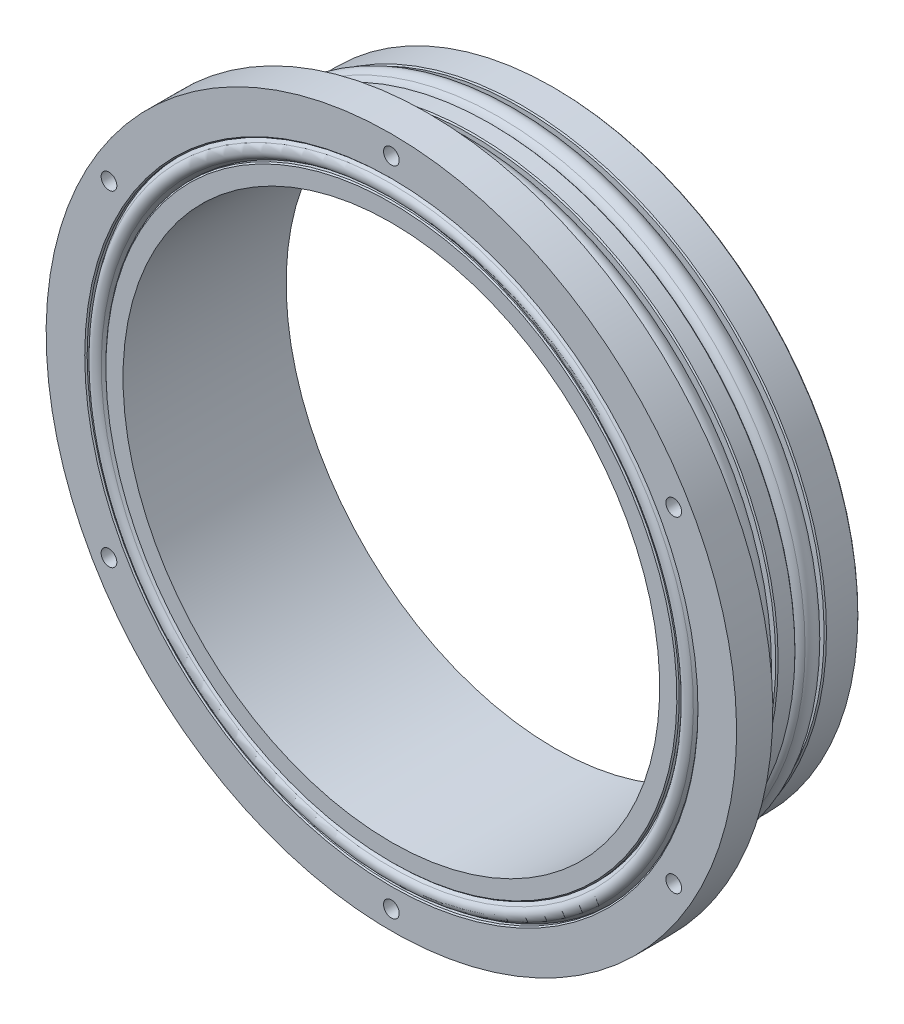
ISO-10303-21;
HEADER;
FILE_DESCRIPTION(('STEP AP214'),'2;1');
FILE_NAME('part.step','',(''),(''),'','','');
FILE_SCHEMA(('AUTOMOTIVE_DESIGN { 1 0 10303 214 1 1 1 1 }'));
ENDSEC;
DATA;
#1=APPLICATION_CONTEXT('core data for automotive mechanical design processes');
#2=APPLICATION_PROTOCOL_DEFINITION('international standard','automotive_design',2000,#1);
#3=PRODUCT_CONTEXT('',#1,'mechanical');
#4=PRODUCT('Part','Part','',(#3));
#5=PRODUCT_RELATED_PRODUCT_CATEGORY('part','',(#4));
#6=PRODUCT_DEFINITION_FORMATION('','',#4);
#7=PRODUCT_DEFINITION_CONTEXT('part definition',#1,'design');
#8=PRODUCT_DEFINITION('design','',#6,#7);
#9=PRODUCT_DEFINITION_SHAPE('','',#8);
#10=(LENGTH_UNIT() NAMED_UNIT(*) SI_UNIT(.MILLI.,.METRE.));
#11=(NAMED_UNIT(*) PLANE_ANGLE_UNIT() SI_UNIT($,.RADIAN.));
#12=(NAMED_UNIT(*) SI_UNIT($,.STERADIAN.) SOLID_ANGLE_UNIT());
#13=UNCERTAINTY_MEASURE_WITH_UNIT(LENGTH_MEASURE(1.E-05),#10,'distance_accuracy_value','');
#14=(GEOMETRIC_REPRESENTATION_CONTEXT(3) GLOBAL_UNCERTAINTY_ASSIGNED_CONTEXT((#13)) GLOBAL_UNIT_ASSIGNED_CONTEXT((#10,
#11,#12)) REPRESENTATION_CONTEXT('',''));
#15=CARTESIAN_POINT('',(0.,0.,0.));
#16=DIRECTION('',(0.,0.,1.));
#17=DIRECTION('',(1.,0.,0.));
#18=AXIS2_PLACEMENT_3D('',#15,#16,#17);
#19=CARTESIAN_POINT('',(0.,0.,136.547343325495));
#20=DIRECTION('',(0.,0.,-1.));
#21=DIRECTION('',(-1.,0.,0.));
#22=AXIS2_PLACEMENT_3D('',#19,#20,#21);
#23=TOROIDAL_SURFACE('',#22,49.1871,1.7653);
#24=CARTESIAN_POINT('',(-50.9524,0.,136.547343325495));
#25=VERTEX_POINT('',#24);
#26=VERTEX_LOOP('',#25);
#27=FACE_BOUND('',#26,.T.);
#28=ADVANCED_FACE('P0_F12',(#27),#23,.T.);
#29=CLOSED_SHELL('',(#28));
#30=MANIFOLD_SOLID_BREP('P0_B1',#29);
#31=CARTESIAN_POINT('',(0.,0.,144.618536633048));
#32=DIRECTION('',(0.,0.,-1.));
#33=DIRECTION('',(-1.,0.,0.));
#34=AXIS2_PLACEMENT_3D('',#31,#32,#33);
#35=TOROIDAL_SURFACE('',#34,49.1871,1.7653);
#36=CARTESIAN_POINT('',(-50.9524,0.,144.618536633048));
#37=VERTEX_POINT('',#36);
#38=VERTEX_LOOP('',#37);
#39=FACE_BOUND('',#38,.T.);
#40=ADVANCED_FACE('P1_F12',(#39),#35,.T.);
#41=CLOSED_SHELL('',(#40));
#42=MANIFOLD_SOLID_BREP('P1_B1',#41);
#43=CARTESIAN_POINT('',(0.,44.419,128.225));
#44=DIRECTION('',(0.,0.,-1.));
#45=DIRECTION('',(0.,1.,0.));
#46=AXIS2_PLACEMENT_3D('',#43,#44,#45);
#47=PLANE('',#46);
#48=CARTESIAN_POINT('',(0.,-46.99,128.225));
#49=DIRECTION('',(0.,0.,-1.));
#50=DIRECTION('',(0.,1.,0.));
#51=AXIS2_PLACEMENT_3D('',#48,#49,#50);
#52=CIRCLE('',#51,1.3);
#53=CARTESIAN_POINT('',(0.,-45.69,128.225));
#54=VERTEX_POINT('',#53);
#55=EDGE_CURVE('P2_E170',#54,#54,#52,.T.);
#56=ORIENTED_EDGE('',*,*,#55,.F.);
#57=EDGE_LOOP('',(#56));
#58=FACE_BOUND('',#57,.T.);
#59=CARTESIAN_POINT('',(-46.99,0.,128.225));
#60=DIRECTION('',(0.,0.,-1.));
#61=DIRECTION('',(0.,1.,0.));
#62=AXIS2_PLACEMENT_3D('',#59,#60,#61);
#63=CIRCLE('',#62,1.3);
#64=CARTESIAN_POINT('',(-46.99,1.3,128.225));
#65=VERTEX_POINT('',#64);
#66=EDGE_CURVE('P2_E164',#65,#65,#63,.T.);
#67=ORIENTED_EDGE('',*,*,#66,.F.);
#68=EDGE_LOOP('',(#67));
#69=FACE_BOUND('',#68,.T.);
#70=CARTESIAN_POINT('',(0.,46.99,128.225));
#71=DIRECTION('',(0.,0.,-1.));
#72=DIRECTION('',(0.,1.,0.));
#73=AXIS2_PLACEMENT_3D('',#70,#71,#72);
#74=CIRCLE('',#73,1.3);
#75=CARTESIAN_POINT('',(0.,48.29,128.225));
#76=VERTEX_POINT('',#75);
#77=EDGE_CURVE('P2_E158',#76,#76,#74,.T.);
#78=ORIENTED_EDGE('',*,*,#77,.F.);
#79=EDGE_LOOP('',(#78));
#80=FACE_BOUND('',#79,.T.);
#81=CARTESIAN_POINT('',(46.99,0.,128.225));
#82=DIRECTION('',(0.,0.,-1.));
#83=DIRECTION('',(0.,1.,0.));
#84=AXIS2_PLACEMENT_3D('',#81,#82,#83);
#85=CIRCLE('',#84,1.3);
#86=CARTESIAN_POINT('',(46.99,1.3,128.225));
#87=VERTEX_POINT('',#86);
#88=EDGE_CURVE('P2_E152',#87,#87,#85,.T.);
#89=ORIENTED_EDGE('',*,*,#88,.F.);
#90=EDGE_LOOP('',(#89));
#91=FACE_BOUND('',#90,.T.);
#92=CARTESIAN_POINT('',(0.,0.,128.225));
#93=DIRECTION('',(0.,0.,-1.));
#94=DIRECTION('',(0.,1.,0.));
#95=AXIS2_PLACEMENT_3D('',#92,#93,#94);
#96=CIRCLE('',#95,50.219);
#97=CARTESIAN_POINT('',(0.,50.219,128.225));
#98=VERTEX_POINT('',#97);
#99=EDGE_CURVE('P2_E49',#98,#98,#96,.T.);
#100=ORIENTED_EDGE('',*,*,#99,.T.);
#101=EDGE_LOOP('',(#100));
#102=FACE_BOUND('',#101,.T.);
#103=CARTESIAN_POINT('',(0.,0.,128.225));
#104=DIRECTION('',(0.,0.,-1.));
#105=DIRECTION('',(0.,1.,0.));
#106=AXIS2_PLACEMENT_3D('',#103,#104,#105);
#107=CIRCLE('',#106,44.419);
#108=CARTESIAN_POINT('',(0.,44.419,128.225));
#109=VERTEX_POINT('',#108);
#110=EDGE_CURVE('P2_E112',#109,#109,#107,.T.);
#111=ORIENTED_EDGE('',*,*,#110,.F.);
#112=EDGE_LOOP('',(#111));
#113=FACE_BOUND('',#112,.T.);
#114=ADVANCED_FACE('P2_F14',(#58,#69,#80,#91,#102,#113),#47,.T.);
#115=CARTESIAN_POINT('',(0.,0.,128.225));
#116=DIRECTION('',(0.,0.,-1.));
#117=DIRECTION('',(0.,1.,0.));
#118=AXIS2_PLACEMENT_3D('',#115,#116,#117);
#119=CYLINDRICAL_SURFACE('',#118,50.419);
#120=CARTESIAN_POINT('',(0.,0.,128.425));
#121=DIRECTION('',(0.,0.,-1.));
#122=DIRECTION('',(0.,1.,0.));
#123=AXIS2_PLACEMENT_3D('',#120,#121,#122);
#124=CIRCLE('',#123,50.419);
#125=CARTESIAN_POINT('',(0.,50.419,128.425));
#126=VERTEX_POINT('',#125);
#127=EDGE_CURVE('P2_E43',#126,#126,#124,.F.);
#128=ORIENTED_EDGE('',*,*,#127,.T.);
#129=EDGE_LOOP('',(#128));
#130=FACE_BOUND('',#129,.T.);
#131=CARTESIAN_POINT('',(0.,0.,133.612));
#132=DIRECTION('',(0.,0.,1.));
#133=DIRECTION('',(0.,-1.,0.));
#134=AXIS2_PLACEMENT_3D('',#131,#132,#133);
#135=CIRCLE('',#134,50.419);
#136=CARTESIAN_POINT('',(0.,-50.419,133.612));
#137=VERTEX_POINT('',#136);
#138=EDGE_CURVE('P2_E46',#137,#137,#135,.F.);
#139=ORIENTED_EDGE('',*,*,#138,.T.);
#140=EDGE_LOOP('',(#139));
#141=FACE_BOUND('',#140,.T.);
#142=ADVANCED_FACE('P2_F187',(#130,#141),#119,.T.);
#143=CARTESIAN_POINT('',(0.,49.04105,133.812));
#144=DIRECTION('',(0.,0.,1.));
#145=DIRECTION('',(0.,-1.,0.));
#146=AXIS2_PLACEMENT_3D('',#143,#144,#145);
#147=PLANE('',#146);
#148=CARTESIAN_POINT('',(0.,0.,133.812));
#149=DIRECTION('',(0.,0.,1.));
#150=DIRECTION('',(0.,-1.,0.));
#151=AXIS2_PLACEMENT_3D('',#148,#149,#150);
#152=CIRCLE('',#151,50.219);
#153=CARTESIAN_POINT('',(0.,-50.219,133.812));
#154=VERTEX_POINT('',#153);
#155=EDGE_CURVE('P2_E34',#154,#154,#152,.T.);
#156=ORIENTED_EDGE('',*,*,#155,.T.);
#157=EDGE_LOOP('',(#156));
#158=FACE_BOUND('',#157,.T.);
#159=CARTESIAN_POINT('',(0.,0.,133.812));
#160=DIRECTION('',(0.,0.,-1.));
#161=DIRECTION('',(0.,1.,0.));
#162=AXIS2_PLACEMENT_3D('',#159,#160,#161);
#163=CIRCLE('',#162,49.04105);
#164=CARTESIAN_POINT('',(0.,49.04105,133.812));
#165=VERTEX_POINT('',#164);
#166=EDGE_CURVE('P2_E64',#165,#165,#163,.T.);
#167=ORIENTED_EDGE('',*,*,#166,.T.);
#168=EDGE_LOOP('',(#167));
#169=FACE_BOUND('',#168,.T.);
#170=ADVANCED_FACE('P2_F288',(#158,#169),#147,.T.);
#171=CARTESIAN_POINT('',(0.,0.,133.812));
#172=DIRECTION('',(0.,0.,1.));
#173=DIRECTION('',(0.,-1.,0.));
#174=AXIS2_PLACEMENT_3D('',#171,#172,#173);
#175=CONICAL_SURFACE('',#174,49.04105,0.966336052037726);
#176=CARTESIAN_POINT('',(0.,0.,134.772495355148));
#177=DIRECTION('',(0.,0.,-1.));
#178=DIRECTION('',(0.,1.,0.));
#179=AXIS2_PLACEMENT_3D('',#176,#177,#178);
#180=CIRCLE('',#179,50.431651885961);
#181=CARTESIAN_POINT('',(0.,50.431651885961,134.772495355148));
#182=VERTEX_POINT('',#181);
#183=EDGE_CURVE('P2_E67',#182,#182,#180,.T.);
#184=ORIENTED_EDGE('',*,*,#183,.T.);
#185=EDGE_LOOP('',(#184));
#186=FACE_BOUND('',#185,.T.);
#187=ORIENTED_EDGE('',*,*,#166,.F.);
#188=EDGE_LOOP('',(#187));
#189=FACE_BOUND('',#188,.T.);
#190=ADVANCED_FACE('P2_F284',(#186,#189),#175,.T.);
#191=CARTESIAN_POINT('',(0.,0.,136.225));
#192=DIRECTION('',(0.,0.,-1.));
#193=DIRECTION('',(0.,1.,0.));
#194=AXIS2_PLACEMENT_3D('',#191,#192,#193);
#195=TOROIDAL_SURFACE('',#194,49.4284,1.7653);
#196=CARTESIAN_POINT('',(0.,0.,137.677504644852));
#197=DIRECTION('',(0.,0.,-1.));
#198=DIRECTION('',(0.,1.,0.));
#199=AXIS2_PLACEMENT_3D('',#196,#197,#198);
#200=CIRCLE('',#199,50.431651885961);
#201=CARTESIAN_POINT('',(0.,50.431651885961,137.677504644852));
#202=VERTEX_POINT('',#201);
#203=EDGE_CURVE('P2_E70',#202,#202,#200,.T.);
#204=ORIENTED_EDGE('',*,*,#203,.T.);
#205=EDGE_LOOP('',(#204));
#206=FACE_BOUND('',#205,.T.);
#207=ORIENTED_EDGE('',*,*,#183,.F.);
#208=EDGE_LOOP('',(#207));
#209=FACE_BOUND('',#208,.T.);
#210=ADVANCED_FACE('P2_F280',(#206,#209),#195,.T.);
#211=CARTESIAN_POINT('',(0.,0.,137.677504644852));
#212=DIRECTION('',(0.,0.,-1.));
#213=DIRECTION('',(0.,1.,0.));
#214=AXIS2_PLACEMENT_3D('',#211,#212,#213);
#215=CONICAL_SURFACE('',#214,50.431651885961,0.966336052037726);
#216=CARTESIAN_POINT('',(0.,0.,138.638));
#217=DIRECTION('',(0.,0.,-1.));
#218=DIRECTION('',(0.,1.,0.));
#219=AXIS2_PLACEMENT_3D('',#216,#217,#218);
#220=CIRCLE('',#219,49.04105);
#221=CARTESIAN_POINT('',(0.,49.04105,138.638));
#222=VERTEX_POINT('',#221);
#223=EDGE_CURVE('P2_E73',#222,#222,#220,.T.);
#224=ORIENTED_EDGE('',*,*,#223,.T.);
#225=EDGE_LOOP('',(#224));
#226=FACE_BOUND('',#225,.T.);
#227=ORIENTED_EDGE('',*,*,#203,.F.);
#228=EDGE_LOOP('',(#227));
#229=FACE_BOUND('',#228,.T.);
#230=ADVANCED_FACE('P2_F276',(#226,#229),#215,.T.);
#231=CARTESIAN_POINT('',(0.,50.419,138.638));
#232=DIRECTION('',(0.,0.,-1.));
#233=DIRECTION('',(0.,1.,0.));
#234=AXIS2_PLACEMENT_3D('',#231,#232,#233);
#235=PLANE('',#234);
#236=CARTESIAN_POINT('',(0.,0.,138.638));
#237=DIRECTION('',(0.,0.,-1.));
#238=DIRECTION('',(0.,1.,0.));
#239=AXIS2_PLACEMENT_3D('',#236,#237,#238);
#240=CIRCLE('',#239,50.219);
#241=CARTESIAN_POINT('',(0.,50.219,138.638));
#242=VERTEX_POINT('',#241);
#243=EDGE_CURVE('P2_E29',#242,#242,#240,.T.);
#244=ORIENTED_EDGE('',*,*,#243,.T.);
#245=EDGE_LOOP('',(#244));
#246=FACE_BOUND('',#245,.T.);
#247=ORIENTED_EDGE('',*,*,#223,.F.);
#248=EDGE_LOOP('',(#247));
#249=FACE_BOUND('',#248,.T.);
#250=ADVANCED_FACE('P2_F273',(#246,#249),#235,.T.);
#251=CARTESIAN_POINT('',(0.,0.,128.225));
#252=DIRECTION('',(0.,0.,-1.));
#253=DIRECTION('',(0.,1.,0.));
#254=AXIS2_PLACEMENT_3D('',#251,#252,#253);
#255=CYLINDRICAL_SURFACE('',#254,50.419);
#256=CARTESIAN_POINT('',(0.,0.,138.838));
#257=DIRECTION('',(0.,0.,-1.));
#258=DIRECTION('',(0.,1.,0.));
#259=AXIS2_PLACEMENT_3D('',#256,#257,#258);
#260=CIRCLE('',#259,50.419);
#261=CARTESIAN_POINT('',(0.,50.419,138.838));
#262=VERTEX_POINT('',#261);
#263=EDGE_CURVE('P2_E21',#262,#262,#260,.F.);
#264=ORIENTED_EDGE('',*,*,#263,.T.);
#265=EDGE_LOOP('',(#264));
#266=FACE_BOUND('',#265,.T.);
#267=CARTESIAN_POINT('',(0.,0.,141.612));
#268=DIRECTION('',(0.,0.,1.));
#269=DIRECTION('',(0.,-1.,0.));
#270=AXIS2_PLACEMENT_3D('',#267,#268,#269);
#271=CIRCLE('',#270,50.419);
#272=CARTESIAN_POINT('',(0.,-50.419,141.612));
#273=VERTEX_POINT('',#272);
#274=EDGE_CURVE('P2_E25',#273,#273,#271,.F.);
#275=ORIENTED_EDGE('',*,*,#274,.T.);
#276=EDGE_LOOP('',(#275));
#277=FACE_BOUND('',#276,.T.);
#278=ADVANCED_FACE('P2_F270',(#266,#277),#255,.T.);
#279=CARTESIAN_POINT('',(0.,49.04105,141.812));
#280=DIRECTION('',(0.,0.,1.));
#281=DIRECTION('',(0.,-1.,0.));
#282=AXIS2_PLACEMENT_3D('',#279,#280,#281);
#283=PLANE('',#282);
#284=CARTESIAN_POINT('',(0.,0.,141.812));
#285=DIRECTION('',(0.,0.,1.));
#286=DIRECTION('',(0.,-1.,0.));
#287=AXIS2_PLACEMENT_3D('',#284,#285,#286);
#288=CIRCLE('',#287,50.219);
#289=CARTESIAN_POINT('',(0.,-50.219,141.812));
#290=VERTEX_POINT('',#289);
#291=EDGE_CURVE('P2_E10',#290,#290,#288,.T.);
#292=ORIENTED_EDGE('',*,*,#291,.T.);
#293=EDGE_LOOP('',(#292));
#294=FACE_BOUND('',#293,.T.);
#295=CARTESIAN_POINT('',(0.,0.,141.812));
#296=DIRECTION('',(0.,0.,-1.));
#297=DIRECTION('',(0.,1.,0.));
#298=AXIS2_PLACEMENT_3D('',#295,#296,#297);
#299=CIRCLE('',#298,49.04105);
#300=CARTESIAN_POINT('',(0.,49.04105,141.812));
#301=VERTEX_POINT('',#300);
#302=EDGE_CURVE('P2_E76',#301,#301,#299,.T.);
#303=ORIENTED_EDGE('',*,*,#302,.T.);
#304=EDGE_LOOP('',(#303));
#305=FACE_BOUND('',#304,.T.);
#306=ADVANCED_FACE('P2_F266',(#294,#305),#283,.T.);
#307=CARTESIAN_POINT('',(0.,0.,141.812));
#308=DIRECTION('',(0.,0.,1.));
#309=DIRECTION('',(0.,-1.,0.));
#310=AXIS2_PLACEMENT_3D('',#307,#308,#309);
#311=CONICAL_SURFACE('',#310,49.04105,0.966336052037727);
#312=CARTESIAN_POINT('',(0.,0.,142.772495355148));
#313=DIRECTION('',(0.,0.,-1.));
#314=DIRECTION('',(0.,1.,0.));
#315=AXIS2_PLACEMENT_3D('',#312,#313,#314);
#316=CIRCLE('',#315,50.431651885961);
#317=CARTESIAN_POINT('',(0.,50.431651885961,142.772495355148));
#318=VERTEX_POINT('',#317);
#319=EDGE_CURVE('P2_E79',#318,#318,#316,.T.);
#320=ORIENTED_EDGE('',*,*,#319,.T.);
#321=EDGE_LOOP('',(#320));
#322=FACE_BOUND('',#321,.T.);
#323=ORIENTED_EDGE('',*,*,#302,.F.);
#324=EDGE_LOOP('',(#323));
#325=FACE_BOUND('',#324,.T.);
#326=ADVANCED_FACE('P2_F262',(#322,#325),#311,.T.);
#327=CARTESIAN_POINT('',(0.,0.,144.225));
#328=DIRECTION('',(0.,0.,-1.));
#329=DIRECTION('',(0.,1.,0.));
#330=AXIS2_PLACEMENT_3D('',#327,#328,#329);
#331=TOROIDAL_SURFACE('',#330,49.4284,1.7653);
#332=CARTESIAN_POINT('',(0.,0.,145.677504644852));
#333=DIRECTION('',(0.,0.,-1.));
#334=DIRECTION('',(0.,1.,0.));
#335=AXIS2_PLACEMENT_3D('',#332,#333,#334);
#336=CIRCLE('',#335,50.431651885961);
#337=CARTESIAN_POINT('',(0.,50.431651885961,145.677504644852));
#338=VERTEX_POINT('',#337);
#339=EDGE_CURVE('P2_E82',#338,#338,#336,.T.);
#340=ORIENTED_EDGE('',*,*,#339,.T.);
#341=EDGE_LOOP('',(#340));
#342=FACE_BOUND('',#341,.T.);
#343=ORIENTED_EDGE('',*,*,#319,.F.);
#344=EDGE_LOOP('',(#343));
#345=FACE_BOUND('',#344,.T.);
#346=ADVANCED_FACE('P2_F258',(#342,#345),#331,.T.);
#347=CARTESIAN_POINT('',(0.,0.,145.677504644852));
#348=DIRECTION('',(0.,0.,-1.));
#349=DIRECTION('',(0.,1.,0.));
#350=AXIS2_PLACEMENT_3D('',#347,#348,#349);
#351=CONICAL_SURFACE('',#350,50.431651885961,0.966336052037724);
#352=CARTESIAN_POINT('',(0.,0.,146.638));
#353=DIRECTION('',(0.,0.,-1.));
#354=DIRECTION('',(0.,1.,0.));
#355=AXIS2_PLACEMENT_3D('',#352,#353,#354);
#356=CIRCLE('',#355,49.04105);
#357=CARTESIAN_POINT('',(0.,49.04105,146.638));
#358=VERTEX_POINT('',#357);
#359=EDGE_CURVE('P2_E85',#358,#358,#356,.T.);
#360=ORIENTED_EDGE('',*,*,#359,.T.);
#361=EDGE_LOOP('',(#360));
#362=FACE_BOUND('',#361,.T.);
#363=ORIENTED_EDGE('',*,*,#339,.F.);
#364=EDGE_LOOP('',(#363));
#365=FACE_BOUND('',#364,.T.);
#366=ADVANCED_FACE('P2_F254',(#362,#365),#351,.T.);
#367=CARTESIAN_POINT('',(0.,50.419,146.638));
#368=DIRECTION('',(0.,0.,-1.));
#369=DIRECTION('',(0.,1.,0.));
#370=AXIS2_PLACEMENT_3D('',#367,#368,#369);
#371=PLANE('',#370);
#372=CARTESIAN_POINT('',(0.,0.,146.638));
#373=DIRECTION('',(0.,0.,-1.));
#374=DIRECTION('',(0.,1.,0.));
#375=AXIS2_PLACEMENT_3D('',#372,#373,#374);
#376=CIRCLE('',#375,50.219);
#377=CARTESIAN_POINT('',(0.,50.219,146.638));
#378=VERTEX_POINT('',#377);
#379=EDGE_CURVE('P2_E40',#378,#378,#376,.T.);
#380=ORIENTED_EDGE('',*,*,#379,.T.);
#381=EDGE_LOOP('',(#380));
#382=FACE_BOUND('',#381,.T.);
#383=ORIENTED_EDGE('',*,*,#359,.F.);
#384=EDGE_LOOP('',(#383));
#385=FACE_BOUND('',#384,.T.);
#386=ADVANCED_FACE('P2_F250',(#382,#385),#371,.T.);
#387=CARTESIAN_POINT('',(0.,0.,128.225));
#388=DIRECTION('',(0.,0.,-1.));
#389=DIRECTION('',(0.,1.,0.));
#390=AXIS2_PLACEMENT_3D('',#387,#388,#389);
#391=CYLINDRICAL_SURFACE('',#390,50.419);
#392=CARTESIAN_POINT('',(0.,0.,146.838));
#393=DIRECTION('',(0.,0.,-1.));
#394=DIRECTION('',(0.,1.,0.));
#395=AXIS2_PLACEMENT_3D('',#392,#393,#394);
#396=CIRCLE('',#395,50.419);
#397=CARTESIAN_POINT('',(0.,50.419,146.838));
#398=VERTEX_POINT('',#397);
#399=EDGE_CURVE('P2_E37',#398,#398,#396,.F.);
#400=ORIENTED_EDGE('',*,*,#399,.T.);
#401=EDGE_LOOP('',(#400));
#402=FACE_BOUND('',#401,.T.);
#403=CARTESIAN_POINT('',(0.,0.,149.225));
#404=DIRECTION('',(0.,0.,-1.));
#405=DIRECTION('',(0.,1.,0.));
#406=AXIS2_PLACEMENT_3D('',#403,#404,#405);
#407=CIRCLE('',#406,50.419);
#408=CARTESIAN_POINT('',(0.,50.419,149.225));
#409=VERTEX_POINT('',#408);
#410=EDGE_CURVE('P2_E88',#409,#409,#407,.T.);
#411=ORIENTED_EDGE('',*,*,#410,.T.);
#412=EDGE_LOOP('',(#411));
#413=FACE_BOUND('',#412,.T.);
#414=ADVANCED_FACE('P2_F246',(#402,#413),#391,.T.);
#415=CARTESIAN_POINT('',(0.,50.419,149.225));
#416=DIRECTION('',(0.,0.,-1.));
#417=DIRECTION('',(0.,1.,0.));
#418=AXIS2_PLACEMENT_3D('',#415,#416,#417);
#419=PLANE('',#418);
#420=CARTESIAN_POINT('',(-46.7437211692651,26.9875,149.225));
#421=DIRECTION('',(0.,0.,-1.));
#422=DIRECTION('',(0.,1.,0.));
#423=AXIS2_PLACEMENT_3D('',#420,#421,#422);
#424=CIRCLE('',#423,1.3);
#425=CARTESIAN_POINT('',(-46.7437211692651,28.2875,149.225));
#426=VERTEX_POINT('',#425);
#427=EDGE_CURVE('P2_E145',#426,#426,#424,.F.);
#428=ORIENTED_EDGE('',*,*,#427,.T.);
#429=EDGE_LOOP('',(#428));
#430=FACE_BOUND('',#429,.T.);
#431=CARTESIAN_POINT('',(-46.7437211692651,-26.9875,149.225));
#432=DIRECTION('',(0.,0.,-1.));
#433=DIRECTION('',(0.,1.,0.));
#434=AXIS2_PLACEMENT_3D('',#431,#432,#433);
#435=CIRCLE('',#434,1.3);
#436=CARTESIAN_POINT('',(-46.7437211692651,-25.6875,149.225));
#437=VERTEX_POINT('',#436);
#438=EDGE_CURVE('P2_E139',#437,#437,#435,.F.);
#439=ORIENTED_EDGE('',*,*,#438,.T.);
#440=EDGE_LOOP('',(#439));
#441=FACE_BOUND('',#440,.T.);
#442=CARTESIAN_POINT('',(0.,-53.975,149.225));
#443=DIRECTION('',(0.,0.,-1.));
#444=DIRECTION('',(0.,1.,0.));
#445=AXIS2_PLACEMENT_3D('',#442,#443,#444);
#446=CIRCLE('',#445,1.3);
#447=CARTESIAN_POINT('',(0.,-52.675,149.225));
#448=VERTEX_POINT('',#447);
#449=EDGE_CURVE('P2_E133',#448,#448,#446,.F.);
#450=ORIENTED_EDGE('',*,*,#449,.T.);
#451=EDGE_LOOP('',(#450));
#452=FACE_BOUND('',#451,.T.);
#453=CARTESIAN_POINT('',(46.7437211692651,-26.9875,149.225));
#454=DIRECTION('',(0.,0.,-1.));
#455=DIRECTION('',(0.,1.,0.));
#456=AXIS2_PLACEMENT_3D('',#453,#454,#455);
#457=CIRCLE('',#456,1.3);
#458=CARTESIAN_POINT('',(46.7437211692651,-25.6875,149.225));
#459=VERTEX_POINT('',#458);
#460=EDGE_CURVE('P2_E127',#459,#459,#457,.F.);
#461=ORIENTED_EDGE('',*,*,#460,.T.);
#462=EDGE_LOOP('',(#461));
#463=FACE_BOUND('',#462,.T.);
#464=CARTESIAN_POINT('',(46.7437211692651,26.9875,149.225));
#465=DIRECTION('',(0.,0.,-1.));
#466=DIRECTION('',(0.,1.,0.));
#467=AXIS2_PLACEMENT_3D('',#464,#465,#466);
#468=CIRCLE('',#467,1.3);
#469=CARTESIAN_POINT('',(46.7437211692651,28.2875,149.225));
#470=VERTEX_POINT('',#469);
#471=EDGE_CURVE('P2_E121',#470,#470,#468,.F.);
#472=ORIENTED_EDGE('',*,*,#471,.T.);
#473=EDGE_LOOP('',(#472));
#474=FACE_BOUND('',#473,.T.);
#475=CARTESIAN_POINT('',(0.,53.975,149.225));
#476=DIRECTION('',(0.,0.,-1.));
#477=DIRECTION('',(0.,1.,0.));
#478=AXIS2_PLACEMENT_3D('',#475,#476,#477);
#479=CIRCLE('',#478,1.3);
#480=CARTESIAN_POINT('',(0.,55.275,149.225));
#481=VERTEX_POINT('',#480);
#482=EDGE_CURVE('P2_E115',#481,#481,#479,.F.);
#483=ORIENTED_EDGE('',*,*,#482,.T.);
#484=EDGE_LOOP('',(#483));
#485=FACE_BOUND('',#484,.T.);
#486=CARTESIAN_POINT('',(0.,0.,149.225));
#487=DIRECTION('',(0.,0.,-1.));
#488=DIRECTION('',(0.,1.,0.));
#489=AXIS2_PLACEMENT_3D('',#486,#487,#488);
#490=CIRCLE('',#489,57.15);
#491=CARTESIAN_POINT('',(0.,57.15,149.225));
#492=VERTEX_POINT('',#491);
#493=EDGE_CURVE('P2_E91',#492,#492,#490,.T.);
#494=ORIENTED_EDGE('',*,*,#493,.T.);
#495=EDGE_LOOP('',(#494));
#496=FACE_BOUND('',#495,.T.);
#497=ORIENTED_EDGE('',*,*,#410,.F.);
#498=EDGE_LOOP('',(#497));
#499=FACE_BOUND('',#498,.T.);
#500=ADVANCED_FACE('P2_F242',(#430,#441,#452,#463,#474,#485,#496,#499),#419,.T.);
#501=CARTESIAN_POINT('',(0.,0.,128.225));
#502=DIRECTION('',(0.,0.,-1.));
#503=DIRECTION('',(0.,1.,0.));
#504=AXIS2_PLACEMENT_3D('',#501,#502,#503);
#505=CYLINDRICAL_SURFACE('',#504,57.15);
#506=CARTESIAN_POINT('',(0.,0.,155.225));
#507=DIRECTION('',(0.,0.,-1.));
#508=DIRECTION('',(0.,1.,0.));
#509=AXIS2_PLACEMENT_3D('',#506,#507,#508);
#510=CIRCLE('',#509,57.15);
#511=CARTESIAN_POINT('',(0.,57.15,155.225));
#512=VERTEX_POINT('',#511);
#513=EDGE_CURVE('P2_E94',#512,#512,#510,.T.);
#514=ORIENTED_EDGE('',*,*,#513,.T.);
#515=EDGE_LOOP('',(#514));
#516=FACE_BOUND('',#515,.T.);
#517=ORIENTED_EDGE('',*,*,#493,.F.);
#518=EDGE_LOOP('',(#517));
#519=FACE_BOUND('',#518,.T.);
#520=ADVANCED_FACE('P2_F238',(#516,#519),#505,.T.);
#521=CARTESIAN_POINT('',(0.,57.15,155.225));
#522=DIRECTION('',(0.,0.,1.));
#523=DIRECTION('',(0.,-1.,0.));
#524=AXIS2_PLACEMENT_3D('',#521,#522,#523);
#525=PLANE('',#524);
#526=CARTESIAN_POINT('',(0.,0.,155.225));
#527=DIRECTION('',(0.,0.,1.));
#528=DIRECTION('',(0.,-1.,0.));
#529=AXIS2_PLACEMENT_3D('',#526,#527,#528);
#530=CIRCLE('',#529,50.7587);
#531=CARTESIAN_POINT('',(0.,-50.7587,155.225));
#532=VERTEX_POINT('',#531);
#533=EDGE_CURVE('P2_E61',#532,#532,#530,.F.);
#534=ORIENTED_EDGE('',*,*,#533,.T.);
#535=EDGE_LOOP('',(#534));
#536=FACE_BOUND('',#535,.T.);
#537=CARTESIAN_POINT('',(-46.7437211692651,26.9875,155.225));
#538=DIRECTION('',(0.,0.,1.));
#539=DIRECTION('',(1.,0.,0.));
#540=AXIS2_PLACEMENT_3D('',#537,#538,#539);
#541=CIRCLE('',#540,1.3);
#542=CARTESIAN_POINT('',(-45.4437211692651,26.9875,155.225));
#543=VERTEX_POINT('',#542);
#544=EDGE_CURVE('P2_E148',#543,#543,#541,.T.);
#545=ORIENTED_EDGE('',*,*,#544,.F.);
#546=EDGE_LOOP('',(#545));
#547=FACE_BOUND('',#546,.T.);
#548=CARTESIAN_POINT('',(-46.7437211692651,-26.9875,155.225));
#549=DIRECTION('',(0.,0.,1.));
#550=DIRECTION('',(1.,0.,0.));
#551=AXIS2_PLACEMENT_3D('',#548,#549,#550);
#552=CIRCLE('',#551,1.3);
#553=CARTESIAN_POINT('',(-45.4437211692651,-26.9875,155.225));
#554=VERTEX_POINT('',#553);
#555=EDGE_CURVE('P2_E142',#554,#554,#552,.T.);
#556=ORIENTED_EDGE('',*,*,#555,.F.);
#557=EDGE_LOOP('',(#556));
#558=FACE_BOUND('',#557,.T.);
#559=CARTESIAN_POINT('',(0.,-53.975,155.225));
#560=DIRECTION('',(0.,0.,1.));
#561=DIRECTION('',(1.,0.,0.));
#562=AXIS2_PLACEMENT_3D('',#559,#560,#561);
#563=CIRCLE('',#562,1.3);
#564=CARTESIAN_POINT('',(1.30000000000001,-53.975,155.225));
#565=VERTEX_POINT('',#564);
#566=EDGE_CURVE('P2_E136',#565,#565,#563,.T.);
#567=ORIENTED_EDGE('',*,*,#566,.F.);
#568=EDGE_LOOP('',(#567));
#569=FACE_BOUND('',#568,.T.);
#570=CARTESIAN_POINT('',(46.7437211692651,-26.9875,155.225));
#571=DIRECTION('',(0.,0.,1.));
#572=DIRECTION('',(1.,0.,0.));
#573=AXIS2_PLACEMENT_3D('',#570,#571,#572);
#574=CIRCLE('',#573,1.3);
#575=CARTESIAN_POINT('',(48.0437211692651,-26.9875,155.225));
#576=VERTEX_POINT('',#575);
#577=EDGE_CURVE('P2_E130',#576,#576,#574,.T.);
#578=ORIENTED_EDGE('',*,*,#577,.F.);
#579=EDGE_LOOP('',(#578));
#580=FACE_BOUND('',#579,.T.);
#581=CARTESIAN_POINT('',(46.7437211692651,26.9875,155.225));
#582=DIRECTION('',(0.,0.,1.));
#583=DIRECTION('',(1.,0.,0.));
#584=AXIS2_PLACEMENT_3D('',#581,#582,#583);
#585=CIRCLE('',#584,1.3);
#586=CARTESIAN_POINT('',(48.0437211692651,26.9875,155.225));
#587=VERTEX_POINT('',#586);
#588=EDGE_CURVE('P2_E124',#587,#587,#585,.T.);
#589=ORIENTED_EDGE('',*,*,#588,.F.);
#590=EDGE_LOOP('',(#589));
#591=FACE_BOUND('',#590,.T.);
#592=CARTESIAN_POINT('',(0.,53.975,155.225));
#593=DIRECTION('',(0.,0.,1.));
#594=DIRECTION('',(1.,0.,0.));
#595=AXIS2_PLACEMENT_3D('',#592,#593,#594);
#596=CIRCLE('',#595,1.3);
#597=CARTESIAN_POINT('',(1.3,53.975,155.225));
#598=VERTEX_POINT('',#597);
#599=EDGE_CURVE('P2_E118',#598,#598,#596,.T.);
#600=ORIENTED_EDGE('',*,*,#599,.F.);
#601=EDGE_LOOP('',(#600));
#602=FACE_BOUND('',#601,.T.);
#603=ORIENTED_EDGE('',*,*,#513,.F.);
#604=EDGE_LOOP('',(#603));
#605=FACE_BOUND('',#604,.T.);
#606=ADVANCED_FACE('P2_F234',(#536,#547,#558,#569,#580,#591,#602,#605),#525,.T.);
#607=CARTESIAN_POINT('',(0.,0.,128.225));
#608=DIRECTION('',(0.,0.,-1.));
#609=DIRECTION('',(0.,1.,0.));
#610=AXIS2_PLACEMENT_3D('',#607,#608,#609);
#611=CYLINDRICAL_SURFACE('',#610,50.5587);
#612=CARTESIAN_POINT('',(0.,0.,155.025));
#613=DIRECTION('',(0.,0.,1.));
#614=DIRECTION('',(0.,-1.,0.));
#615=AXIS2_PLACEMENT_3D('',#612,#613,#614);
#616=CIRCLE('',#615,50.5587);
#617=CARTESIAN_POINT('',(0.,-50.5587,155.025));
#618=VERTEX_POINT('',#617);
#619=EDGE_CURVE('P2_E58',#618,#618,#616,.T.);
#620=ORIENTED_EDGE('',*,*,#619,.T.);
#621=EDGE_LOOP('',(#620));
#622=FACE_BOUND('',#621,.T.);
#623=CARTESIAN_POINT('',(0.,0.,154.504170235136));
#624=DIRECTION('',(0.,0.,-1.));
#625=DIRECTION('',(0.,1.,0.));
#626=AXIS2_PLACEMENT_3D('',#623,#624,#625);
#627=CIRCLE('',#626,50.5587);
#628=CARTESIAN_POINT('',(0.,50.5587,154.504170235136));
#629=VERTEX_POINT('',#628);
#630=EDGE_CURVE('P2_E97',#629,#629,#627,.T.);
#631=ORIENTED_EDGE('',*,*,#630,.T.);
#632=EDGE_LOOP('',(#631));
#633=FACE_BOUND('',#632,.T.);
#634=ADVANCED_FACE('P2_F230',(#622,#633),#611,.F.);
#635=CARTESIAN_POINT('',(0.,0.,154.504170235136));
#636=DIRECTION('',(0.,0.,-1.));
#637=DIRECTION('',(0.,1.,0.));
#638=AXIS2_PLACEMENT_3D('',#635,#636,#637);
#639=CONICAL_SURFACE('',#638,50.5587,0.634842696572141);
#640=CARTESIAN_POINT('',(0.,0.,155.244014620009));
#641=DIRECTION('',(0.,0.,-1.));
#642=DIRECTION('',(0.,1.,0.));
#643=AXIS2_PLACEMENT_3D('',#640,#641,#642);
#644=CIRCLE('',#643,50.0137615637377);
#645=CARTESIAN_POINT('',(0.,50.0137615637377,155.244014620009));
#646=VERTEX_POINT('',#645);
#647=EDGE_CURVE('P2_E100',#646,#646,#644,.T.);
#648=ORIENTED_EDGE('',*,*,#647,.T.);
#649=EDGE_LOOP('',(#648));
#650=FACE_BOUND('',#649,.T.);
#651=ORIENTED_EDGE('',*,*,#630,.F.);
#652=EDGE_LOOP('',(#651));
#653=FACE_BOUND('',#652,.T.);
#654=ADVANCED_FACE('P2_F226',(#650,#653),#639,.T.);
#655=CARTESIAN_POINT('',(0.,0.,154.504170235136));
#656=DIRECTION('',(0.,0.,-1.));
#657=DIRECTION('',(0.,1.,0.));
#658=AXIS2_PLACEMENT_3D('',#655,#656,#657);
#659=TOROIDAL_SURFACE('',#658,49.0093,1.24752264382461);
#660=CARTESIAN_POINT('',(0.,0.,155.244014620009));
#661=DIRECTION('',(0.,0.,-1.));
#662=DIRECTION('',(0.,1.,0.));
#663=AXIS2_PLACEMENT_3D('',#660,#661,#662);
#664=CIRCLE('',#663,48.0048384362623);
#665=CARTESIAN_POINT('',(0.,48.0048384362623,155.244014620009));
#666=VERTEX_POINT('',#665);
#667=EDGE_CURVE('P2_E103',#666,#666,#664,.T.);
#668=ORIENTED_EDGE('',*,*,#667,.T.);
#669=EDGE_LOOP('',(#668));
#670=FACE_BOUND('',#669,.T.);
#671=ORIENTED_EDGE('',*,*,#647,.F.);
#672=EDGE_LOOP('',(#671));
#673=FACE_BOUND('',#672,.T.);
#674=ADVANCED_FACE('P2_F222',(#670,#673),#659,.T.);
#675=CARTESIAN_POINT('',(0.,0.,155.244014620009));
#676=DIRECTION('',(0.,0.,1.));
#677=DIRECTION('',(0.,-1.,0.));
#678=AXIS2_PLACEMENT_3D('',#675,#676,#677);
#679=CONICAL_SURFACE('',#678,48.0048384362623,0.634842696572118);
#680=CARTESIAN_POINT('',(0.,0.,154.504170235136));
#681=DIRECTION('',(0.,0.,-1.));
#682=DIRECTION('',(0.,1.,0.));
#683=AXIS2_PLACEMENT_3D('',#680,#681,#682);
#684=CIRCLE('',#683,47.4599);
#685=CARTESIAN_POINT('',(0.,47.4599,154.504170235136));
#686=VERTEX_POINT('',#685);
#687=EDGE_CURVE('P2_E106',#686,#686,#684,.T.);
#688=ORIENTED_EDGE('',*,*,#687,.T.);
#689=EDGE_LOOP('',(#688));
#690=FACE_BOUND('',#689,.T.);
#691=ORIENTED_EDGE('',*,*,#667,.F.);
#692=EDGE_LOOP('',(#691));
#693=FACE_BOUND('',#692,.T.);
#694=ADVANCED_FACE('P2_F215',(#690,#693),#679,.F.);
#695=CARTESIAN_POINT('',(0.,0.,128.225));
#696=DIRECTION('',(0.,0.,-1.));
#697=DIRECTION('',(0.,1.,0.));
#698=AXIS2_PLACEMENT_3D('',#695,#696,#697);
#699=CYLINDRICAL_SURFACE('',#698,47.4599);
#700=CARTESIAN_POINT('',(0.,0.,155.025));
#701=DIRECTION('',(0.,0.,1.));
#702=DIRECTION('',(0.,-1.,0.));
#703=AXIS2_PLACEMENT_3D('',#700,#701,#702);
#704=CIRCLE('',#703,47.4599);
#705=CARTESIAN_POINT('',(0.,-47.4599,155.025));
#706=VERTEX_POINT('',#705);
#707=EDGE_CURVE('P2_E55',#706,#706,#704,.F.);
#708=ORIENTED_EDGE('',*,*,#707,.T.);
#709=EDGE_LOOP('',(#708));
#710=FACE_BOUND('',#709,.T.);
#711=ORIENTED_EDGE('',*,*,#687,.F.);
#712=EDGE_LOOP('',(#711));
#713=FACE_BOUND('',#712,.T.);
#714=ADVANCED_FACE('P2_F208',(#710,#713),#699,.T.);
#715=CARTESIAN_POINT('',(0.,47.4599,155.225));
#716=DIRECTION('',(0.,0.,1.));
#717=DIRECTION('',(0.,-1.,0.));
#718=AXIS2_PLACEMENT_3D('',#715,#716,#717);
#719=PLANE('',#718);
#720=CARTESIAN_POINT('',(0.,0.,155.225));
#721=DIRECTION('',(0.,0.,1.));
#722=DIRECTION('',(0.,-1.,0.));
#723=AXIS2_PLACEMENT_3D('',#720,#721,#722);
#724=CIRCLE('',#723,47.2599);
#725=CARTESIAN_POINT('',(0.,-47.2599,155.225));
#726=VERTEX_POINT('',#725);
#727=EDGE_CURVE('P2_E52',#726,#726,#724,.T.);
#728=ORIENTED_EDGE('',*,*,#727,.T.);
#729=EDGE_LOOP('',(#728));
#730=FACE_BOUND('',#729,.T.);
#731=CARTESIAN_POINT('',(0.,0.,155.225));
#732=DIRECTION('',(0.,0.,-1.));
#733=DIRECTION('',(0.,1.,0.));
#734=AXIS2_PLACEMENT_3D('',#731,#732,#733);
#735=CIRCLE('',#734,44.419);
#736=CARTESIAN_POINT('',(0.,44.419,155.225));
#737=VERTEX_POINT('',#736);
#738=EDGE_CURVE('P2_E109',#737,#737,#735,.T.);
#739=ORIENTED_EDGE('',*,*,#738,.T.);
#740=EDGE_LOOP('',(#739));
#741=FACE_BOUND('',#740,.T.);
#742=ADVANCED_FACE('P2_F203',(#730,#741),#719,.T.);
#743=CARTESIAN_POINT('',(0.,0.,128.225));
#744=DIRECTION('',(0.,0.,-1.));
#745=DIRECTION('',(0.,1.,0.));
#746=AXIS2_PLACEMENT_3D('',#743,#744,#745);
#747=CYLINDRICAL_SURFACE('',#746,44.419);
#748=ORIENTED_EDGE('',*,*,#110,.T.);
#749=EDGE_LOOP('',(#748));
#750=FACE_BOUND('',#749,.T.);
#751=ORIENTED_EDGE('',*,*,#738,.F.);
#752=EDGE_LOOP('',(#751));
#753=FACE_BOUND('',#752,.T.);
#754=ADVANCED_FACE('P2_F199',(#750,#753),#747,.F.);
#755=CARTESIAN_POINT('',(0.,53.975,145.54804473783));
#756=DIRECTION('',(0.,0.,1.));
#757=DIRECTION('',(1.,0.,0.));
#758=AXIS2_PLACEMENT_3D('',#755,#756,#757);
#759=CYLINDRICAL_SURFACE('',#758,1.3);
#760=ORIENTED_EDGE('',*,*,#599,.T.);
#761=EDGE_LOOP('',(#760));
#762=FACE_BOUND('',#761,.T.);
#763=ORIENTED_EDGE('',*,*,#482,.F.);
#764=EDGE_LOOP('',(#763));
#765=FACE_BOUND('',#764,.T.);
#766=ADVANCED_FACE('P2_F202',(#762,#765),#759,.F.);
#767=CARTESIAN_POINT('',(46.7437211692651,26.9875,145.54804473783));
#768=DIRECTION('',(0.,0.,1.));
#769=DIRECTION('',(1.,0.,0.));
#770=AXIS2_PLACEMENT_3D('',#767,#768,#769);
#771=CYLINDRICAL_SURFACE('',#770,1.3);
#772=ORIENTED_EDGE('',*,*,#588,.T.);
#773=EDGE_LOOP('',(#772));
#774=FACE_BOUND('',#773,.T.);
#775=ORIENTED_EDGE('',*,*,#471,.F.);
#776=EDGE_LOOP('',(#775));
#777=FACE_BOUND('',#776,.T.);
#778=ADVANCED_FACE('P2_F368',(#774,#777),#771,.F.);
#779=CARTESIAN_POINT('',(46.7437211692651,-26.9875,145.54804473783));
#780=DIRECTION('',(0.,0.,1.));
#781=DIRECTION('',(1.,0.,0.));
#782=AXIS2_PLACEMENT_3D('',#779,#780,#781);
#783=CYLINDRICAL_SURFACE('',#782,1.3);
#784=ORIENTED_EDGE('',*,*,#577,.T.);
#785=EDGE_LOOP('',(#784));
#786=FACE_BOUND('',#785,.T.);
#787=ORIENTED_EDGE('',*,*,#460,.F.);
#788=EDGE_LOOP('',(#787));
#789=FACE_BOUND('',#788,.T.);
#790=ADVANCED_FACE('P2_F364',(#786,#789),#783,.F.);
#791=CARTESIAN_POINT('',(0.,-53.975,145.54804473783));
#792=DIRECTION('',(0.,0.,1.));
#793=DIRECTION('',(1.,0.,0.));
#794=AXIS2_PLACEMENT_3D('',#791,#792,#793);
#795=CYLINDRICAL_SURFACE('',#794,1.3);
#796=ORIENTED_EDGE('',*,*,#566,.T.);
#797=EDGE_LOOP('',(#796));
#798=FACE_BOUND('',#797,.T.);
#799=ORIENTED_EDGE('',*,*,#449,.F.);
#800=EDGE_LOOP('',(#799));
#801=FACE_BOUND('',#800,.T.);
#802=ADVANCED_FACE('P2_F360',(#798,#801),#795,.F.);
#803=CARTESIAN_POINT('',(-46.7437211692651,-26.9875,145.54804473783));
#804=DIRECTION('',(0.,0.,1.));
#805=DIRECTION('',(1.,0.,0.));
#806=AXIS2_PLACEMENT_3D('',#803,#804,#805);
#807=CYLINDRICAL_SURFACE('',#806,1.3);
#808=ORIENTED_EDGE('',*,*,#555,.T.);
#809=EDGE_LOOP('',(#808));
#810=FACE_BOUND('',#809,.T.);
#811=ORIENTED_EDGE('',*,*,#438,.F.);
#812=EDGE_LOOP('',(#811));
#813=FACE_BOUND('',#812,.T.);
#814=ADVANCED_FACE('P2_F356',(#810,#813),#807,.F.);
#815=CARTESIAN_POINT('',(-46.7437211692651,26.9875,145.54804473783));
#816=DIRECTION('',(0.,0.,1.));
#817=DIRECTION('',(1.,0.,0.));
#818=AXIS2_PLACEMENT_3D('',#815,#816,#817);
#819=CYLINDRICAL_SURFACE('',#818,1.3);
#820=ORIENTED_EDGE('',*,*,#544,.T.);
#821=EDGE_LOOP('',(#820));
#822=FACE_BOUND('',#821,.T.);
#823=ORIENTED_EDGE('',*,*,#427,.F.);
#824=EDGE_LOOP('',(#823));
#825=FACE_BOUND('',#824,.T.);
#826=ADVANCED_FACE('P2_F300',(#822,#825),#819,.F.);
#827=CARTESIAN_POINT('',(0.,0.,155.225));
#828=DIRECTION('',(0.,0.,1.));
#829=DIRECTION('',(0.,-1.,0.));
#830=AXIS2_PLACEMENT_3D('',#827,#828,#829);
#831=CONICAL_SURFACE('',#830,50.7587,0.785398163397448);
#832=ORIENTED_EDGE('',*,*,#619,.F.);
#833=EDGE_LOOP('',(#832));
#834=FACE_BOUND('',#833,.T.);
#835=ORIENTED_EDGE('',*,*,#533,.F.);
#836=EDGE_LOOP('',(#835));
#837=FACE_BOUND('',#836,.T.);
#838=ADVANCED_FACE('P2_F296',(#834,#837),#831,.F.);
#839=CARTESIAN_POINT('',(0.,0.,155.025));
#840=DIRECTION('',(0.,0.,-1.));
#841=DIRECTION('',(0.,1.,0.));
#842=AXIS2_PLACEMENT_3D('',#839,#840,#841);
#843=CONICAL_SURFACE('',#842,47.4599,0.785398163397414);
#844=ORIENTED_EDGE('',*,*,#727,.F.);
#845=EDGE_LOOP('',(#844));
#846=FACE_BOUND('',#845,.T.);
#847=ORIENTED_EDGE('',*,*,#707,.F.);
#848=EDGE_LOOP('',(#847));
#849=FACE_BOUND('',#848,.T.);
#850=ADVANCED_FACE('P2_F299',(#846,#849),#843,.T.);
#851=CARTESIAN_POINT('',(0.,0.,128.225));
#852=DIRECTION('',(0.,0.,1.));
#853=DIRECTION('',(0.,-1.,0.));
#854=AXIS2_PLACEMENT_3D('',#851,#852,#853);
#855=CONICAL_SURFACE('',#854,50.219,0.7853981633975);
#856=ORIENTED_EDGE('',*,*,#127,.F.);
#857=EDGE_LOOP('',(#856));
#858=FACE_BOUND('',#857,.T.);
#859=ORIENTED_EDGE('',*,*,#99,.F.);
#860=EDGE_LOOP('',(#859));
#861=FACE_BOUND('',#860,.T.);
#862=ADVANCED_FACE('P2_F304',(#858,#861),#855,.T.);
#863=CARTESIAN_POINT('',(0.,0.,146.638));
#864=DIRECTION('',(0.,0.,1.));
#865=DIRECTION('',(0.,-1.,0.));
#866=AXIS2_PLACEMENT_3D('',#863,#864,#865);
#867=CONICAL_SURFACE('',#866,50.219,0.785398163397431);
#868=ORIENTED_EDGE('',*,*,#399,.F.);
#869=EDGE_LOOP('',(#868));
#870=FACE_BOUND('',#869,.T.);
#871=ORIENTED_EDGE('',*,*,#379,.F.);
#872=EDGE_LOOP('',(#871));
#873=FACE_BOUND('',#872,.T.);
#874=ADVANCED_FACE('P2_F308',(#870,#873),#867,.T.);
#875=CARTESIAN_POINT('',(0.,0.,133.612));
#876=DIRECTION('',(0.,0.,-1.));
#877=DIRECTION('',(0.,1.,0.));
#878=AXIS2_PLACEMENT_3D('',#875,#876,#877);
#879=CONICAL_SURFACE('',#878,50.419,0.785398163397431);
#880=ORIENTED_EDGE('',*,*,#155,.F.);
#881=EDGE_LOOP('',(#880));
#882=FACE_BOUND('',#881,.T.);
#883=ORIENTED_EDGE('',*,*,#138,.F.);
#884=EDGE_LOOP('',(#883));
#885=FACE_BOUND('',#884,.T.);
#886=ADVANCED_FACE('P2_F312',(#882,#885),#879,.T.);
#887=CARTESIAN_POINT('',(0.,0.,138.638));
#888=DIRECTION('',(0.,0.,1.));
#889=DIRECTION('',(0.,-1.,0.));
#890=AXIS2_PLACEMENT_3D('',#887,#888,#889);
#891=CONICAL_SURFACE('',#890,50.219,0.785398163397431);
#892=ORIENTED_EDGE('',*,*,#263,.F.);
#893=EDGE_LOOP('',(#892));
#894=FACE_BOUND('',#893,.T.);
#895=ORIENTED_EDGE('',*,*,#243,.F.);
#896=EDGE_LOOP('',(#895));
#897=FACE_BOUND('',#896,.T.);
#898=ADVANCED_FACE('P2_F315',(#894,#897),#891,.T.);
#899=CARTESIAN_POINT('',(0.,0.,141.612));
#900=DIRECTION('',(0.,0.,-1.));
#901=DIRECTION('',(0.,1.,0.));
#902=AXIS2_PLACEMENT_3D('',#899,#900,#901);
#903=CONICAL_SURFACE('',#902,50.419,0.785398163397466);
#904=ORIENTED_EDGE('',*,*,#291,.F.);
#905=EDGE_LOOP('',(#904));
#906=FACE_BOUND('',#905,.T.);
#907=ORIENTED_EDGE('',*,*,#274,.F.);
#908=EDGE_LOOP('',(#907));
#909=FACE_BOUND('',#908,.T.);
#910=ADVANCED_FACE('P2_F16',(#906,#909),#903,.T.);
#911=CARTESIAN_POINT('',(46.99,0.,132.225));
#912=DIRECTION('',(0.,0.,-1.));
#913=DIRECTION('',(0.,1.,0.));
#914=AXIS2_PLACEMENT_3D('',#911,#912,#913);
#915=CYLINDRICAL_SURFACE('',#914,1.3);
#916=CARTESIAN_POINT('',(46.99,0.,132.225));
#917=DIRECTION('',(0.,0.,-1.));
#918=DIRECTION('',(0.,1.,0.));
#919=AXIS2_PLACEMENT_3D('',#916,#917,#918);
#920=CIRCLE('',#919,1.3);
#921=CARTESIAN_POINT('',(46.99,1.3,132.225));
#922=VERTEX_POINT('',#921);
#923=EDGE_CURVE('P2_E151',#922,#922,#920,.T.);
#924=ORIENTED_EDGE('',*,*,#923,.F.);
#925=EDGE_LOOP('',(#924));
#926=FACE_BOUND('',#925,.T.);
#927=ORIENTED_EDGE('',*,*,#88,.T.);
#928=EDGE_LOOP('',(#927));
#929=FACE_BOUND('',#928,.T.);
#930=ADVANCED_FACE('P2_F322',(#926,#929),#915,.F.);
#931=CARTESIAN_POINT('',(46.99,0.,132.225));
#932=DIRECTION('',(0.,0.,-1.));
#933=DIRECTION('',(0.,1.,0.));
#934=AXIS2_PLACEMENT_3D('',#931,#932,#933);
#935=PLANE('',#934);
#936=ORIENTED_EDGE('',*,*,#923,.T.);
#937=EDGE_LOOP('',(#936));
#938=FACE_BOUND('',#937,.T.);
#939=ADVANCED_FACE('P2_F338',(#938),#935,.T.);
#940=CARTESIAN_POINT('',(0.,46.99,132.225));
#941=DIRECTION('',(0.,0.,-1.));
#942=DIRECTION('',(0.,1.,0.));
#943=AXIS2_PLACEMENT_3D('',#940,#941,#942);
#944=CYLINDRICAL_SURFACE('',#943,1.3);
#945=CARTESIAN_POINT('',(0.,46.99,132.225));
#946=DIRECTION('',(0.,0.,-1.));
#947=DIRECTION('',(0.,1.,0.));
#948=AXIS2_PLACEMENT_3D('',#945,#946,#947);
#949=CIRCLE('',#948,1.3);
#950=CARTESIAN_POINT('',(0.,48.29,132.225));
#951=VERTEX_POINT('',#950);
#952=EDGE_CURVE('P2_E155',#951,#951,#949,.T.);
#953=ORIENTED_EDGE('',*,*,#952,.F.);
#954=EDGE_LOOP('',(#953));
#955=FACE_BOUND('',#954,.T.);
#956=ORIENTED_EDGE('',*,*,#77,.T.);
#957=EDGE_LOOP('',(#956));
#958=FACE_BOUND('',#957,.T.);
#959=ADVANCED_FACE('P2_F347',(#955,#958),#944,.F.);
#960=CARTESIAN_POINT('',(0.,46.99,132.225));
#961=DIRECTION('',(0.,0.,-1.));
#962=DIRECTION('',(0.,1.,0.));
#963=AXIS2_PLACEMENT_3D('',#960,#961,#962);
#964=PLANE('',#963);
#965=ORIENTED_EDGE('',*,*,#952,.T.);
#966=EDGE_LOOP('',(#965));
#967=FACE_BOUND('',#966,.T.);
#968=ADVANCED_FACE('P2_F463',(#967),#964,.T.);
#969=CARTESIAN_POINT('',(-46.99,0.,132.225));
#970=DIRECTION('',(0.,0.,-1.));
#971=DIRECTION('',(0.,1.,0.));
#972=AXIS2_PLACEMENT_3D('',#969,#970,#971);
#973=CYLINDRICAL_SURFACE('',#972,1.3);
#974=CARTESIAN_POINT('',(-46.99,0.,132.225));
#975=DIRECTION('',(0.,0.,-1.));
#976=DIRECTION('',(0.,1.,0.));
#977=AXIS2_PLACEMENT_3D('',#974,#975,#976);
#978=CIRCLE('',#977,1.3);
#979=CARTESIAN_POINT('',(-46.99,1.3,132.225));
#980=VERTEX_POINT('',#979);
#981=EDGE_CURVE('P2_E161',#980,#980,#978,.T.);
#982=ORIENTED_EDGE('',*,*,#981,.F.);
#983=EDGE_LOOP('',(#982));
#984=FACE_BOUND('',#983,.T.);
#985=ORIENTED_EDGE('',*,*,#66,.T.);
#986=EDGE_LOOP('',(#985));
#987=FACE_BOUND('',#986,.T.);
#988=ADVANCED_FACE('P2_F472',(#984,#987),#973,.F.);
#989=CARTESIAN_POINT('',(-46.99,0.,132.225));
#990=DIRECTION('',(0.,0.,-1.));
#991=DIRECTION('',(0.,1.,0.));
#992=AXIS2_PLACEMENT_3D('',#989,#990,#991);
#993=PLANE('',#992);
#994=ORIENTED_EDGE('',*,*,#981,.T.);
#995=EDGE_LOOP('',(#994));
#996=FACE_BOUND('',#995,.T.);
#997=ADVANCED_FACE('P2_F181',(#996),#993,.T.);
#998=CARTESIAN_POINT('',(0.,-46.99,132.225));
#999=DIRECTION('',(0.,0.,-1.));
#1000=DIRECTION('',(0.,1.,0.));
#1001=AXIS2_PLACEMENT_3D('',#998,#999,#1000);
#1002=CYLINDRICAL_SURFACE('',#1001,1.3);
#1003=CARTESIAN_POINT('',(0.,-46.99,132.225));
#1004=DIRECTION('',(0.,0.,-1.));
#1005=DIRECTION('',(0.,1.,0.));
#1006=AXIS2_PLACEMENT_3D('',#1003,#1004,#1005);
#1007=CIRCLE('',#1006,1.3);
#1008=CARTESIAN_POINT('',(0.,-45.69,132.225));
#1009=VERTEX_POINT('',#1008);
#1010=EDGE_CURVE('P2_E167',#1009,#1009,#1007,.T.);
#1011=ORIENTED_EDGE('',*,*,#1010,.F.);
#1012=EDGE_LOOP('',(#1011));
#1013=FACE_BOUND('',#1012,.T.);
#1014=ORIENTED_EDGE('',*,*,#55,.T.);
#1015=EDGE_LOOP('',(#1014));
#1016=FACE_BOUND('',#1015,.T.);
#1017=ADVANCED_FACE('P2_F178',(#1013,#1016),#1002,.F.);
#1018=CARTESIAN_POINT('',(0.,-46.99,132.225));
#1019=DIRECTION('',(0.,0.,-1.));
#1020=DIRECTION('',(0.,1.,0.));
#1021=AXIS2_PLACEMENT_3D('',#1018,#1019,#1020);
#1022=PLANE('',#1021);
#1023=ORIENTED_EDGE('',*,*,#1010,.T.);
#1024=EDGE_LOOP('',(#1023));
#1025=FACE_BOUND('',#1024,.T.);
#1026=ADVANCED_FACE('P2_F176',(#1025),#1022,.T.);
#1027=CLOSED_SHELL('',(#114,#142,#170,#190,#210,#230,#250,#278,#306,#326,#346,#366,#386,#414,
#500,#520,#606,#634,#654,#674,#694,#714,#742,#754,#766,#778,#790,#802,#814,#826,#838,#850,#862,
#874,#886,#898,#910,#930,#939,#959,#968,#988,#997,#1017,#1026));
#1028=MANIFOLD_SOLID_BREP('P2_B1',#1027);
#1029=ADVANCED_BREP_SHAPE_REPRESENTATION('',(#18,#30,#42,#1028),#14);
#1030=SHAPE_DEFINITION_REPRESENTATION(#9,#1029);
ENDSEC;
END-ISO-10303-21;
